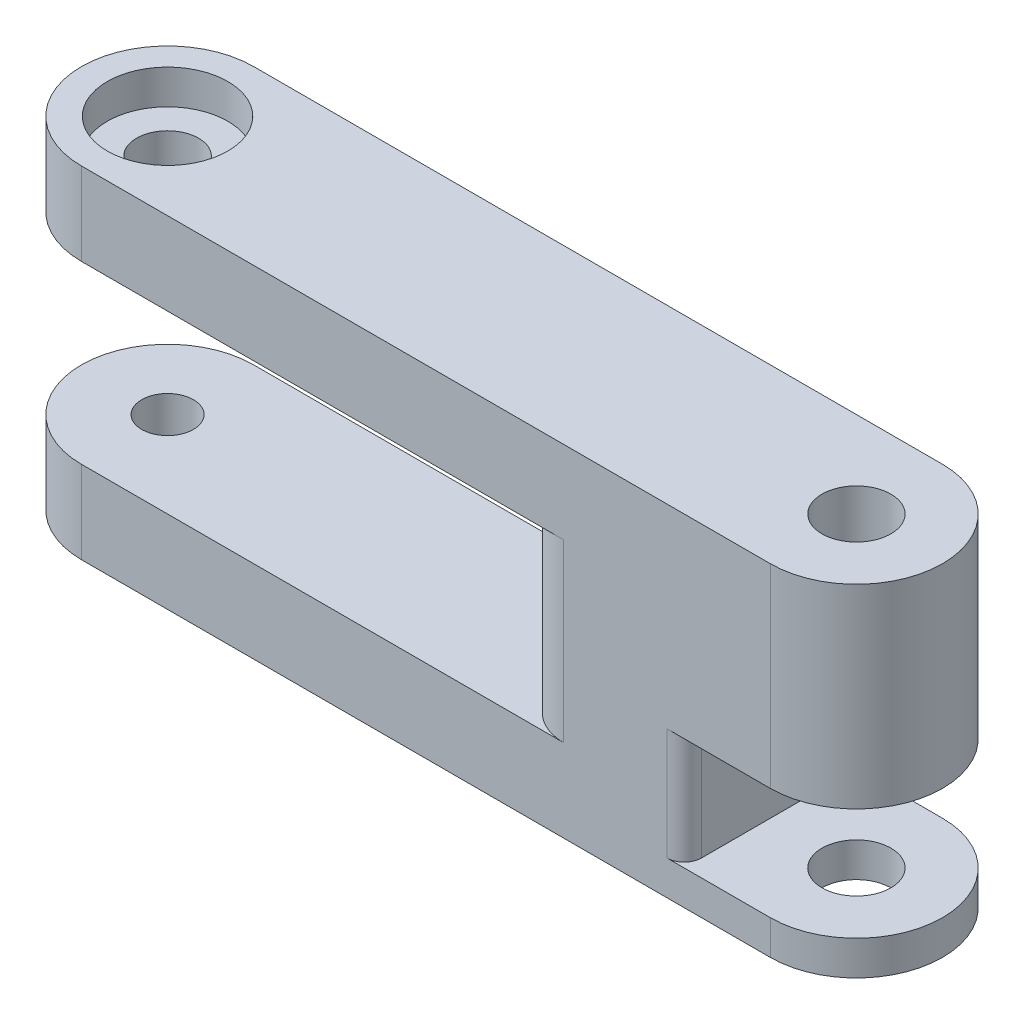
ISO-10303-21;
HEADER;
FILE_DESCRIPTION(('STEP AP214'),'2;1');
FILE_NAME('part.step','',(''),(''),'','','');
FILE_SCHEMA(('AUTOMOTIVE_DESIGN { 1 0 10303 214 1 1 1 1 }'));
ENDSEC;
DATA;
#1=APPLICATION_CONTEXT('core data for automotive mechanical design processes');
#2=APPLICATION_PROTOCOL_DEFINITION('international standard','automotive_design',2000,#1);
#3=PRODUCT_CONTEXT('',#1,'mechanical');
#4=PRODUCT('Part','Part','',(#3));
#5=PRODUCT_RELATED_PRODUCT_CATEGORY('part','',(#4));
#6=PRODUCT_DEFINITION_FORMATION('','',#4);
#7=PRODUCT_DEFINITION_CONTEXT('part definition',#1,'design');
#8=PRODUCT_DEFINITION('design','',#6,#7);
#9=PRODUCT_DEFINITION_SHAPE('','',#8);
#10=(LENGTH_UNIT() NAMED_UNIT(*) SI_UNIT(.MILLI.,.METRE.));
#11=(NAMED_UNIT(*) PLANE_ANGLE_UNIT() SI_UNIT($,.RADIAN.));
#12=(NAMED_UNIT(*) SI_UNIT($,.STERADIAN.) SOLID_ANGLE_UNIT());
#13=UNCERTAINTY_MEASURE_WITH_UNIT(LENGTH_MEASURE(1.E-05),#10,'distance_accuracy_value','');
#14=(GEOMETRIC_REPRESENTATION_CONTEXT(3) GLOBAL_UNCERTAINTY_ASSIGNED_CONTEXT((#13)) GLOBAL_UNIT_ASSIGNED_CONTEXT((#10,
#11,#12)) REPRESENTATION_CONTEXT('',''));
#15=CARTESIAN_POINT('',(0.,0.,0.));
#16=DIRECTION('',(0.,0.,1.));
#17=DIRECTION('',(1.,0.,0.));
#18=AXIS2_PLACEMENT_3D('',#15,#16,#17);
#19=CARTESIAN_POINT('',(25.4,12.573,0.));
#20=DIRECTION('',(0.,-1.,0.));
#21=DIRECTION('',(0.,0.,-1.));
#22=AXIS2_PLACEMENT_3D('',#19,#20,#21);
#23=CYLINDRICAL_SURFACE('',#22,6.35);
#24=CARTESIAN_POINT('',(25.4,-10.033,0.));
#25=DIRECTION('',(0.,-1.,0.));
#26=DIRECTION('',(1.,0.,0.));
#27=AXIS2_PLACEMENT_3D('',#24,#25,#26);
#28=CIRCLE('',#27,6.35);
#29=CARTESIAN_POINT('',(25.4,-10.033,-6.35000000000001));
#30=VERTEX_POINT('',#29);
#31=CARTESIAN_POINT('',(25.4,-10.033,6.34999999999999));
#32=VERTEX_POINT('',#31);
#33=EDGE_CURVE('E240',#30,#32,#28,.T.);
#34=ORIENTED_EDGE('',*,*,#33,.T.);
#35=DIRECTION('',(0.,-1.,0.));
#36=VECTOR('',#35,1.);
#37=CARTESIAN_POINT('',(25.4,12.573,6.34999999999999));
#38=LINE('',#37,#36);
#39=CARTESIAN_POINT('',(25.4,-12.573,6.34999999999999));
#40=VERTEX_POINT('',#39);
#41=EDGE_CURVE('E179',#32,#40,#38,.T.);
#42=ORIENTED_EDGE('',*,*,#41,.T.);
#43=CARTESIAN_POINT('',(25.4,-12.573,0.));
#44=DIRECTION('',(0.,1.,0.));
#45=DIRECTION('',(0.,0.,1.));
#46=AXIS2_PLACEMENT_3D('',#43,#44,#45);
#47=CIRCLE('',#46,6.35);
#48=CARTESIAN_POINT('',(25.4,-12.573,-6.35000000000001));
#49=VERTEX_POINT('',#48);
#50=EDGE_CURVE('E354',#40,#49,#47,.T.);
#51=ORIENTED_EDGE('',*,*,#50,.T.);
#52=DIRECTION('',(0.,-1.,0.));
#53=VECTOR('',#52,1.);
#54=CARTESIAN_POINT('',(25.4,12.573,-6.35000000000001));
#55=LINE('',#54,#53);
#56=EDGE_CURVE('E363',#30,#49,#55,.T.);
#57=ORIENTED_EDGE('',*,*,#56,.F.);
#58=EDGE_LOOP('',(#34,#42,#51,#57));
#59=FACE_BOUND('',#58,.T.);
#60=ADVANCED_FACE('F42',(#59),#23,.T.);
#61=CARTESIAN_POINT('',(25.4,12.573,0.));
#62=DIRECTION('',(0.,-1.,0.));
#63=DIRECTION('',(0.,0.,-1.));
#64=AXIS2_PLACEMENT_3D('',#61,#62,#63);
#65=CYLINDRICAL_SURFACE('',#64,2.54);
#66=CARTESIAN_POINT('',(25.4,-10.033,0.));
#67=DIRECTION('',(0.,-1.,0.));
#68=DIRECTION('',(1.,0.,0.));
#69=AXIS2_PLACEMENT_3D('',#66,#67,#68);
#70=CIRCLE('',#69,2.54);
#71=CARTESIAN_POINT('',(27.94,-10.033,0.));
#72=VERTEX_POINT('',#71);
#73=EDGE_CURVE('E163',#72,#72,#70,.T.);
#74=ORIENTED_EDGE('',*,*,#73,.F.);
#75=EDGE_LOOP('',(#74));
#76=FACE_BOUND('',#75,.T.);
#77=CARTESIAN_POINT('',(25.4,-12.573,0.));
#78=DIRECTION('',(0.,1.,0.));
#79=DIRECTION('',(0.,0.,1.));
#80=AXIS2_PLACEMENT_3D('',#77,#78,#79);
#81=CIRCLE('',#80,2.54);
#82=CARTESIAN_POINT('',(25.4,-12.573,2.53999999999999));
#83=VERTEX_POINT('',#82);
#84=EDGE_CURVE('E324',#83,#83,#81,.T.);
#85=ORIENTED_EDGE('',*,*,#84,.F.);
#86=EDGE_LOOP('',(#85));
#87=FACE_BOUND('',#86,.T.);
#88=ADVANCED_FACE('F420',(#76,#87),#65,.F.);
#89=CARTESIAN_POINT('',(-25.4,12.573,0.));
#90=DIRECTION('',(0.,-1.,0.));
#91=DIRECTION('',(0.,0.,-1.));
#92=AXIS2_PLACEMENT_3D('',#89,#90,#91);
#93=CYLINDRICAL_SURFACE('',#92,2.28600000000001);
#94=CARTESIAN_POINT('',(-25.4,6.477,0.));
#95=DIRECTION('',(0.,1.,0.));
#96=DIRECTION('',(0.,0.,1.));
#97=AXIS2_PLACEMENT_3D('',#94,#95,#96);
#98=CIRCLE('',#97,2.28600000000001);
#99=CARTESIAN_POINT('',(-25.4,6.477,2.28600000000001));
#100=VERTEX_POINT('',#99);
#101=EDGE_CURVE('E192',#100,#100,#98,.T.);
#102=ORIENTED_EDGE('',*,*,#101,.F.);
#103=EDGE_LOOP('',(#102));
#104=FACE_BOUND('',#103,.T.);
#105=CARTESIAN_POINT('',(-25.4,10.033,0.));
#106=DIRECTION('',(0.,1.,0.));
#107=DIRECTION('',(0.,0.,1.));
#108=AXIS2_PLACEMENT_3D('',#105,#106,#107);
#109=CIRCLE('',#108,2.28600000000001);
#110=CARTESIAN_POINT('',(-25.4,10.033,2.28600000000001));
#111=VERTEX_POINT('',#110);
#112=EDGE_CURVE('E198',#111,#111,#109,.T.);
#113=ORIENTED_EDGE('',*,*,#112,.T.);
#114=EDGE_LOOP('',(#113));
#115=FACE_BOUND('',#114,.T.);
#116=ADVANCED_FACE('F425',(#104,#115),#93,.F.);
#117=CARTESIAN_POINT('',(-25.4,12.573,0.));
#118=DIRECTION('',(0.,-1.,0.));
#119=DIRECTION('',(0.,0.,-1.));
#120=AXIS2_PLACEMENT_3D('',#117,#118,#119);
#121=CYLINDRICAL_SURFACE('',#120,6.35);
#122=DIRECTION('',(0.,-1.,0.));
#123=VECTOR('',#122,1.);
#124=CARTESIAN_POINT('',(-25.4,12.573,-6.35));
#125=LINE('',#124,#123);
#126=CARTESIAN_POINT('',(-25.4,12.573,-6.35));
#127=VERTEX_POINT('',#126);
#128=CARTESIAN_POINT('',(-25.4,6.477,-6.35000000000001));
#129=VERTEX_POINT('',#128);
#130=EDGE_CURVE('E360',#127,#129,#125,.T.);
#131=ORIENTED_EDGE('',*,*,#130,.T.);
#132=CARTESIAN_POINT('',(-25.4,6.477,0.));
#133=DIRECTION('',(0.,1.,0.));
#134=DIRECTION('',(0.,0.,1.));
#135=AXIS2_PLACEMENT_3D('',#132,#133,#134);
#136=CIRCLE('',#135,6.35);
#137=CARTESIAN_POINT('',(-25.4,6.477,6.34999999999999));
#138=VERTEX_POINT('',#137);
#139=EDGE_CURVE('E196',#129,#138,#136,.T.);
#140=ORIENTED_EDGE('',*,*,#139,.T.);
#141=DIRECTION('',(0.,-1.,0.));
#142=VECTOR('',#141,1.);
#143=CARTESIAN_POINT('',(-25.4,12.573,6.35));
#144=LINE('',#143,#142);
#145=CARTESIAN_POINT('',(-25.4,12.573,6.35));
#146=VERTEX_POINT('',#145);
#147=EDGE_CURVE('E183',#146,#138,#144,.T.);
#148=ORIENTED_EDGE('',*,*,#147,.F.);
#149=CARTESIAN_POINT('',(-25.4,12.573,0.));
#150=DIRECTION('',(0.,1.,0.));
#151=DIRECTION('',(0.,0.,1.));
#152=AXIS2_PLACEMENT_3D('',#149,#150,#151);
#153=CIRCLE('',#152,6.35);
#154=EDGE_CURVE('E333',#127,#146,#153,.T.);
#155=ORIENTED_EDGE('',*,*,#154,.F.);
#156=EDGE_LOOP('',(#131,#140,#148,#155));
#157=FACE_BOUND('',#156,.T.);
#158=ADVANCED_FACE('F406',(#157),#121,.T.);
#159=CARTESIAN_POINT('',(-25.4,12.573,0.));
#160=DIRECTION('',(0.,1.,0.));
#161=DIRECTION('',(0.,0.,1.));
#162=AXIS2_PLACEMENT_3D('',#159,#160,#161);
#163=PLANE('',#162);
#164=CARTESIAN_POINT('',(-25.4,12.573,0.));
#165=DIRECTION('',(0.,1.,0.));
#166=DIRECTION('',(0.,0.,1.));
#167=AXIS2_PLACEMENT_3D('',#164,#165,#166);
#168=CIRCLE('',#167,4.445);
#169=CARTESIAN_POINT('',(-25.4,12.573,4.445));
#170=VERTEX_POINT('',#169);
#171=EDGE_CURVE('E292',#170,#170,#168,.T.);
#172=ORIENTED_EDGE('',*,*,#171,.F.);
#173=EDGE_LOOP('',(#172));
#174=FACE_BOUND('',#173,.T.);
#175=ORIENTED_EDGE('',*,*,#154,.T.);
#176=DIRECTION('',(1.,0.,0.));
#177=VECTOR('',#176,1.);
#178=CARTESIAN_POINT('',(-25.4,12.573,6.35));
#179=LINE('',#178,#177);
#180=CARTESIAN_POINT('',(25.4,12.573,6.34999999999999));
#181=VERTEX_POINT('',#180);
#182=EDGE_CURVE('E337',#146,#181,#179,.T.);
#183=ORIENTED_EDGE('',*,*,#182,.T.);
#184=CARTESIAN_POINT('',(25.4,12.573,0.));
#185=DIRECTION('',(0.,1.,0.));
#186=DIRECTION('',(0.,0.,1.));
#187=AXIS2_PLACEMENT_3D('',#184,#185,#186);
#188=CIRCLE('',#187,6.35);
#189=CARTESIAN_POINT('',(25.4,12.573,-6.35000000000001));
#190=VERTEX_POINT('',#189);
#191=EDGE_CURVE('E176',#181,#190,#188,.T.);
#192=ORIENTED_EDGE('',*,*,#191,.T.);
#193=DIRECTION('',(-1.,0.,0.));
#194=VECTOR('',#193,1.);
#195=CARTESIAN_POINT('',(-25.4,12.573,-6.35));
#196=LINE('',#195,#194);
#197=EDGE_CURVE('E343',#190,#127,#196,.T.);
#198=ORIENTED_EDGE('',*,*,#197,.T.);
#199=EDGE_LOOP('',(#175,#183,#192,#198));
#200=FACE_BOUND('',#199,.T.);
#201=CARTESIAN_POINT('',(25.4,12.573,0.));
#202=DIRECTION('',(0.,1.,0.));
#203=DIRECTION('',(0.,0.,1.));
#204=AXIS2_PLACEMENT_3D('',#201,#202,#203);
#205=CIRCLE('',#204,2.54);
#206=CARTESIAN_POINT('',(25.4,12.573,2.53999999999999));
#207=VERTEX_POINT('',#206);
#208=EDGE_CURVE('E325',#207,#207,#205,.T.);
#209=ORIENTED_EDGE('',*,*,#208,.F.);
#210=EDGE_LOOP('',(#209));
#211=FACE_BOUND('',#210,.T.);
#212=ADVANCED_FACE('F408',(#174,#200,#211),#163,.T.);
#213=CARTESIAN_POINT('',(-25.4,-12.573,0.));
#214=DIRECTION('',(0.,1.,0.));
#215=DIRECTION('',(0.,0.,1.));
#216=AXIS2_PLACEMENT_3D('',#213,#214,#215);
#217=PLANE('',#216);
#218=CARTESIAN_POINT('',(-25.4,-12.573,0.));
#219=DIRECTION('',(0.,1.,0.));
#220=DIRECTION('',(0.,0.,1.));
#221=AXIS2_PLACEMENT_3D('',#218,#219,#220);
#222=CIRCLE('',#221,6.35);
#223=CARTESIAN_POINT('',(-25.4,-12.573,-6.35));
#224=VERTEX_POINT('',#223);
#225=CARTESIAN_POINT('',(-25.4,-12.573,6.35));
#226=VERTEX_POINT('',#225);
#227=EDGE_CURVE('E329',#224,#226,#222,.T.);
#228=ORIENTED_EDGE('',*,*,#227,.F.);
#229=DIRECTION('',(-1.,0.,0.));
#230=VECTOR('',#229,1.);
#231=CARTESIAN_POINT('',(-25.4,-12.573,-6.35));
#232=LINE('',#231,#230);
#233=EDGE_CURVE('E338',#49,#224,#232,.T.);
#234=ORIENTED_EDGE('',*,*,#233,.F.);
#235=ORIENTED_EDGE('',*,*,#50,.F.);
#236=DIRECTION('',(1.,0.,0.));
#237=VECTOR('',#236,1.);
#238=CARTESIAN_POINT('',(-25.4,-12.573,6.35));
#239=LINE('',#238,#237);
#240=EDGE_CURVE('E350',#226,#40,#239,.T.);
#241=ORIENTED_EDGE('',*,*,#240,.F.);
#242=EDGE_LOOP('',(#228,#234,#235,#241));
#243=FACE_BOUND('',#242,.T.);
#244=ORIENTED_EDGE('',*,*,#84,.T.);
#245=EDGE_LOOP('',(#244));
#246=FACE_BOUND('',#245,.T.);
#247=CARTESIAN_POINT('',(-25.4,-12.573,0.));
#248=DIRECTION('',(0.,1.,0.));
#249=DIRECTION('',(0.,0.,1.));
#250=AXIS2_PLACEMENT_3D('',#247,#248,#249);
#251=CIRCLE('',#250,1.905);
#252=CARTESIAN_POINT('',(-27.305,-12.573,0.));
#253=VERTEX_POINT('',#252);
#254=EDGE_CURVE('E288',#253,#253,#251,.F.);
#255=ORIENTED_EDGE('',*,*,#254,.F.);
#256=EDGE_LOOP('',(#255));
#257=FACE_BOUND('',#256,.T.);
#258=ADVANCED_FACE('F382',(#243,#246,#257),#217,.F.);
#259=CARTESIAN_POINT('',(-25.4,-6.477,6.34999999999999));
#260=VERTEX_POINT('',#259);
#261=EDGE_CURVE('E178',#260,#226,#144,.T.);
#262=ORIENTED_EDGE('',*,*,#261,.F.);
#263=CARTESIAN_POINT('',(-25.4,-6.477,0.));
#264=DIRECTION('',(0.,-1.,0.));
#265=DIRECTION('',(0.,0.,-1.));
#266=AXIS2_PLACEMENT_3D('',#263,#264,#265);
#267=CIRCLE('',#266,6.35);
#268=CARTESIAN_POINT('',(-25.4,-6.477,-6.35000000000001));
#269=VERTEX_POINT('',#268);
#270=EDGE_CURVE('E197',#260,#269,#267,.T.);
#271=ORIENTED_EDGE('',*,*,#270,.T.);
#272=EDGE_CURVE('E346',#269,#224,#125,.T.);
#273=ORIENTED_EDGE('',*,*,#272,.T.);
#274=ORIENTED_EDGE('',*,*,#227,.T.);
#275=EDGE_LOOP('',(#262,#271,#273,#274));
#276=FACE_BOUND('',#275,.T.);
#277=ADVANCED_FACE('F372',(#276),#121,.T.);
#278=CARTESIAN_POINT('',(-25.4,12.573,6.35));
#279=DIRECTION('',(0.,0.,-1.));
#280=DIRECTION('',(-1.,0.,0.));
#281=AXIS2_PLACEMENT_3D('',#278,#279,#280);
#282=PLANE('',#281);
#283=DIRECTION('',(1.,0.,0.));
#284=VECTOR('',#283,1.);
#285=CARTESIAN_POINT('',(31.75,-10.033,6.34999999999999));
#286=LINE('',#285,#284);
#287=CARTESIAN_POINT('',(17.78,-10.033,6.34999999999999));
#288=VERTEX_POINT('',#287);
#289=EDGE_CURVE('E58',#288,#32,#286,.T.);
#290=ORIENTED_EDGE('',*,*,#289,.F.);
#291=DIRECTION('',(0.,-1.,0.));
#292=VECTOR('',#291,1.);
#293=CARTESIAN_POINT('',(17.78,12.573,6.34999999999999));
#294=LINE('',#293,#292);
#295=CARTESIAN_POINT('',(17.78,-1.778,6.34999999999999));
#296=VERTEX_POINT('',#295);
#297=EDGE_CURVE('E171',#288,#296,#294,.F.);
#298=ORIENTED_EDGE('',*,*,#297,.T.);
#299=DIRECTION('',(-1.,0.,0.));
#300=VECTOR('',#299,1.);
#301=CARTESIAN_POINT('',(31.75,-1.778,6.34999999999999));
#302=LINE('',#301,#300);
#303=CARTESIAN_POINT('',(25.4,-1.778,6.34999999999999));
#304=VERTEX_POINT('',#303);
#305=EDGE_CURVE('E65',#304,#296,#302,.T.);
#306=ORIENTED_EDGE('',*,*,#305,.F.);
#307=EDGE_CURVE('E168',#181,#304,#38,.T.);
#308=ORIENTED_EDGE('',*,*,#307,.F.);
#309=ORIENTED_EDGE('',*,*,#182,.F.);
#310=ORIENTED_EDGE('',*,*,#147,.T.);
#311=DIRECTION('',(-1.,0.,0.));
#312=VECTOR('',#311,1.);
#313=CARTESIAN_POINT('',(-31.75,6.477,6.34999999999999));
#314=LINE('',#313,#312);
#315=CARTESIAN_POINT('',(10.16,6.477,6.34999999999999));
#316=VERTEX_POINT('',#315);
#317=EDGE_CURVE('E303',#316,#138,#314,.T.);
#318=ORIENTED_EDGE('',*,*,#317,.F.);
#319=DIRECTION('',(0.,1.,0.));
#320=VECTOR('',#319,1.);
#321=CARTESIAN_POINT('',(10.16,12.573,6.34999999999999));
#322=LINE('',#321,#320);
#323=CARTESIAN_POINT('',(10.16,-6.477,6.34999999999999));
#324=VERTEX_POINT('',#323);
#325=EDGE_CURVE('E214',#316,#324,#322,.F.);
#326=ORIENTED_EDGE('',*,*,#325,.T.);
#327=DIRECTION('',(1.,0.,0.));
#328=VECTOR('',#327,1.);
#329=CARTESIAN_POINT('',(-31.75,-6.477,6.34999999999999));
#330=LINE('',#329,#328);
#331=EDGE_CURVE('E202',#260,#324,#330,.T.);
#332=ORIENTED_EDGE('',*,*,#331,.F.);
#333=ORIENTED_EDGE('',*,*,#261,.T.);
#334=ORIENTED_EDGE('',*,*,#240,.T.);
#335=ORIENTED_EDGE('',*,*,#41,.F.);
#336=EDGE_LOOP('',(#290,#298,#306,#308,#309,#310,#318,#326,#332,#333,#334,#335));
#337=FACE_BOUND('',#336,.T.);
#338=ADVANCED_FACE('F167',(#337),#282,.F.);
#339=ORIENTED_EDGE('',*,*,#307,.T.);
#340=CARTESIAN_POINT('',(25.4,-1.778,0.));
#341=DIRECTION('',(0.,1.,0.));
#342=DIRECTION('',(-1.,0.,0.));
#343=AXIS2_PLACEMENT_3D('',#340,#341,#342);
#344=CIRCLE('',#343,6.35);
#345=CARTESIAN_POINT('',(25.4,-1.778,-6.35000000000001));
#346=VERTEX_POINT('',#345);
#347=EDGE_CURVE('E154',#304,#346,#344,.T.);
#348=ORIENTED_EDGE('',*,*,#347,.T.);
#349=EDGE_CURVE('E185',#190,#346,#55,.T.);
#350=ORIENTED_EDGE('',*,*,#349,.F.);
#351=ORIENTED_EDGE('',*,*,#191,.F.);
#352=EDGE_LOOP('',(#339,#348,#350,#351));
#353=FACE_BOUND('',#352,.T.);
#354=ADVANCED_FACE('F175',(#353),#23,.T.);
#355=CARTESIAN_POINT('',(-25.4,12.573,-6.35));
#356=DIRECTION('',(0.,0.,1.));
#357=DIRECTION('',(1.,0.,0.));
#358=AXIS2_PLACEMENT_3D('',#355,#356,#357);
#359=PLANE('',#358);
#360=DIRECTION('',(0.,-1.,0.));
#361=VECTOR('',#360,1.);
#362=CARTESIAN_POINT('',(17.78,12.573,-6.35000000000001));
#363=LINE('',#362,#361);
#364=CARTESIAN_POINT('',(17.78,-1.778,-6.35000000000001));
#365=VERTEX_POINT('',#364);
#366=CARTESIAN_POINT('',(17.78,-10.033,-6.35000000000001));
#367=VERTEX_POINT('',#366);
#368=EDGE_CURVE('E232',#365,#367,#363,.T.);
#369=ORIENTED_EDGE('',*,*,#368,.T.);
#370=DIRECTION('',(1.,0.,0.));
#371=VECTOR('',#370,1.);
#372=CARTESIAN_POINT('',(31.75,-10.033,-6.35000000000001));
#373=LINE('',#372,#371);
#374=EDGE_CURVE('E273',#367,#30,#373,.T.);
#375=ORIENTED_EDGE('',*,*,#374,.T.);
#376=ORIENTED_EDGE('',*,*,#56,.T.);
#377=ORIENTED_EDGE('',*,*,#233,.T.);
#378=ORIENTED_EDGE('',*,*,#272,.F.);
#379=DIRECTION('',(1.,0.,0.));
#380=VECTOR('',#379,1.);
#381=CARTESIAN_POINT('',(-31.75,-6.477,-6.35000000000001));
#382=LINE('',#381,#380);
#383=CARTESIAN_POINT('',(10.16,-6.477,-6.35000000000001));
#384=VERTEX_POINT('',#383);
#385=EDGE_CURVE('E299',#269,#384,#382,.T.);
#386=ORIENTED_EDGE('',*,*,#385,.T.);
#387=DIRECTION('',(0.,1.,0.));
#388=VECTOR('',#387,1.);
#389=CARTESIAN_POINT('',(10.16,12.573,-6.35000000000001));
#390=LINE('',#389,#388);
#391=CARTESIAN_POINT('',(10.16,6.477,-6.35000000000001));
#392=VERTEX_POINT('',#391);
#393=EDGE_CURVE('E191',#384,#392,#390,.T.);
#394=ORIENTED_EDGE('',*,*,#393,.T.);
#395=DIRECTION('',(-1.,0.,0.));
#396=VECTOR('',#395,1.);
#397=CARTESIAN_POINT('',(-31.75,6.477,-6.35000000000001));
#398=LINE('',#397,#396);
#399=EDGE_CURVE('E302',#392,#129,#398,.T.);
#400=ORIENTED_EDGE('',*,*,#399,.T.);
#401=ORIENTED_EDGE('',*,*,#130,.F.);
#402=ORIENTED_EDGE('',*,*,#197,.F.);
#403=ORIENTED_EDGE('',*,*,#349,.T.);
#404=DIRECTION('',(-1.,0.,0.));
#405=VECTOR('',#404,1.);
#406=CARTESIAN_POINT('',(31.75,-1.778,-6.35000000000001));
#407=LINE('',#406,#405);
#408=EDGE_CURVE('E157',#346,#365,#407,.T.);
#409=ORIENTED_EDGE('',*,*,#408,.T.);
#410=EDGE_LOOP('',(#369,#375,#376,#377,#378,#386,#394,#400,#401,#402,#403,#409));
#411=FACE_BOUND('',#410,.T.);
#412=ADVANCED_FACE('F377',(#411),#359,.F.);
#413=CARTESIAN_POINT('',(25.4,-1.778,0.));
#414=DIRECTION('',(0.,1.,0.));
#415=DIRECTION('',(-1.,0.,0.));
#416=AXIS2_PLACEMENT_3D('',#413,#414,#415);
#417=CIRCLE('',#416,2.54);
#418=CARTESIAN_POINT('',(22.86,-1.778,0.));
#419=VERTEX_POINT('',#418);
#420=EDGE_CURVE('E164',#419,#419,#417,.T.);
#421=ORIENTED_EDGE('',*,*,#420,.F.);
#422=EDGE_LOOP('',(#421));
#423=FACE_BOUND('',#422,.T.);
#424=ORIENTED_EDGE('',*,*,#208,.T.);
#425=EDGE_LOOP('',(#424));
#426=FACE_BOUND('',#425,.T.);
#427=ADVANCED_FACE('F428',(#423,#426),#65,.F.);
#428=CARTESIAN_POINT('',(-31.75,6.477,-6.35000000000001));
#429=DIRECTION('',(0.,1.,0.));
#430=DIRECTION('',(0.,0.,1.));
#431=AXIS2_PLACEMENT_3D('',#428,#429,#430);
#432=PLANE('',#431);
#433=ORIENTED_EDGE('',*,*,#101,.T.);
#434=EDGE_LOOP('',(#433));
#435=FACE_BOUND('',#434,.T.);
#436=ORIENTED_EDGE('',*,*,#399,.F.);
#437=CARTESIAN_POINT('',(10.16,6.477,-2.54000000000001));
#438=DIRECTION('',(0.,1.,0.));
#439=DIRECTION('',(0.,0.,1.));
#440=AXIS2_PLACEMENT_3D('',#437,#438,#439);
#441=CIRCLE('',#440,3.81);
#442=CARTESIAN_POINT('',(6.35,6.477,-2.54000000000001));
#443=VERTEX_POINT('',#442);
#444=EDGE_CURVE('E218',#392,#443,#441,.T.);
#445=ORIENTED_EDGE('',*,*,#444,.T.);
#446=DIRECTION('',(0.,0.,1.));
#447=VECTOR('',#446,1.);
#448=CARTESIAN_POINT('',(6.35,6.477,-6.35000000000001));
#449=LINE('',#448,#447);
#450=CARTESIAN_POINT('',(6.35,6.477,2.53999999999999));
#451=VERTEX_POINT('',#450);
#452=EDGE_CURVE('E313',#443,#451,#449,.T.);
#453=ORIENTED_EDGE('',*,*,#452,.T.);
#454=CARTESIAN_POINT('',(10.16,6.477,2.53999999999999));
#455=DIRECTION('',(0.,1.,0.));
#456=DIRECTION('',(0.,0.,1.));
#457=AXIS2_PLACEMENT_3D('',#454,#455,#456);
#458=CIRCLE('',#457,3.81);
#459=EDGE_CURVE('E225',#451,#316,#458,.T.);
#460=ORIENTED_EDGE('',*,*,#459,.T.);
#461=ORIENTED_EDGE('',*,*,#317,.T.);
#462=ORIENTED_EDGE('',*,*,#139,.F.);
#463=EDGE_LOOP('',(#436,#445,#453,#460,#461,#462));
#464=FACE_BOUND('',#463,.T.);
#465=ADVANCED_FACE('F399',(#435,#464),#432,.F.);
#466=CARTESIAN_POINT('',(-31.75,-6.477,-6.35000000000001));
#467=DIRECTION('',(0.,-1.,0.));
#468=DIRECTION('',(0.,0.,-1.));
#469=AXIS2_PLACEMENT_3D('',#466,#467,#468);
#470=PLANE('',#469);
#471=ORIENTED_EDGE('',*,*,#331,.T.);
#472=CARTESIAN_POINT('',(10.16,-6.477,2.53999999999999));
#473=DIRECTION('',(0.,-1.,0.));
#474=DIRECTION('',(0.,0.,-1.));
#475=AXIS2_PLACEMENT_3D('',#472,#473,#474);
#476=CIRCLE('',#475,3.81);
#477=CARTESIAN_POINT('',(6.35,-6.477,2.53999999999999));
#478=VERTEX_POINT('',#477);
#479=EDGE_CURVE('E229',#324,#478,#476,.T.);
#480=ORIENTED_EDGE('',*,*,#479,.T.);
#481=DIRECTION('',(0.,0.,1.));
#482=VECTOR('',#481,1.);
#483=CARTESIAN_POINT('',(6.35,-6.477,-6.35000000000001));
#484=LINE('',#483,#482);
#485=CARTESIAN_POINT('',(6.35,-6.477,-2.54000000000001));
#486=VERTEX_POINT('',#485);
#487=EDGE_CURVE('E307',#486,#478,#484,.T.);
#488=ORIENTED_EDGE('',*,*,#487,.F.);
#489=CARTESIAN_POINT('',(10.16,-6.477,-2.54000000000001));
#490=DIRECTION('',(0.,-1.,0.));
#491=DIRECTION('',(0.,0.,-1.));
#492=AXIS2_PLACEMENT_3D('',#489,#490,#491);
#493=CIRCLE('',#492,3.81);
#494=EDGE_CURVE('E221',#486,#384,#493,.T.);
#495=ORIENTED_EDGE('',*,*,#494,.T.);
#496=ORIENTED_EDGE('',*,*,#385,.F.);
#497=ORIENTED_EDGE('',*,*,#270,.F.);
#498=EDGE_LOOP('',(#471,#480,#488,#495,#496,#497));
#499=FACE_BOUND('',#498,.T.);
#500=CARTESIAN_POINT('',(-25.4,-6.477,0.));
#501=DIRECTION('',(0.,1.,0.));
#502=DIRECTION('',(-1.,0.,0.));
#503=AXIS2_PLACEMENT_3D('',#500,#501,#502);
#504=CIRCLE('',#503,1.905);
#505=CARTESIAN_POINT('',(-27.305,-6.477,0.));
#506=VERTEX_POINT('',#505);
#507=EDGE_CURVE('E284',#506,#506,#504,.T.);
#508=ORIENTED_EDGE('',*,*,#507,.F.);
#509=EDGE_LOOP('',(#508));
#510=FACE_BOUND('',#509,.T.);
#511=ADVANCED_FACE('F388',(#499,#510),#470,.F.);
#512=CARTESIAN_POINT('',(6.35,6.477,-6.35000000000001));
#513=DIRECTION('',(1.,0.,0.));
#514=DIRECTION('',(0.,0.,-1.));
#515=AXIS2_PLACEMENT_3D('',#512,#513,#514);
#516=PLANE('',#515);
#517=ORIENTED_EDGE('',*,*,#452,.F.);
#518=DIRECTION('',(0.,1.,0.));
#519=VECTOR('',#518,1.);
#520=CARTESIAN_POINT('',(6.35,6.477,-2.54000000000001));
#521=LINE('',#520,#519);
#522=EDGE_CURVE('E211',#443,#486,#521,.F.);
#523=ORIENTED_EDGE('',*,*,#522,.T.);
#524=ORIENTED_EDGE('',*,*,#487,.T.);
#525=DIRECTION('',(0.,1.,0.));
#526=VECTOR('',#525,1.);
#527=CARTESIAN_POINT('',(6.35,6.477,2.53999999999999));
#528=LINE('',#527,#526);
#529=EDGE_CURVE('E207',#478,#451,#528,.T.);
#530=ORIENTED_EDGE('',*,*,#529,.T.);
#531=EDGE_LOOP('',(#517,#523,#524,#530));
#532=FACE_BOUND('',#531,.T.);
#533=ADVANCED_FACE('F401',(#532),#516,.F.);
#534=CARTESIAN_POINT('',(-25.4,10.033,0.));
#535=DIRECTION('',(0.,1.,0.));
#536=DIRECTION('',(0.,0.,1.));
#537=AXIS2_PLACEMENT_3D('',#534,#535,#536);
#538=CYLINDRICAL_SURFACE('',#537,4.445);
#539=CARTESIAN_POINT('',(-25.4,10.033,0.));
#540=DIRECTION('',(0.,1.,0.));
#541=DIRECTION('',(0.,0.,1.));
#542=AXIS2_PLACEMENT_3D('',#539,#540,#541);
#543=CIRCLE('',#542,4.445);
#544=CARTESIAN_POINT('',(-25.4,10.033,4.445));
#545=VERTEX_POINT('',#544);
#546=EDGE_CURVE('E203',#545,#545,#543,.T.);
#547=ORIENTED_EDGE('',*,*,#546,.F.);
#548=EDGE_LOOP('',(#547));
#549=FACE_BOUND('',#548,.T.);
#550=ORIENTED_EDGE('',*,*,#171,.T.);
#551=EDGE_LOOP('',(#550));
#552=FACE_BOUND('',#551,.T.);
#553=ADVANCED_FACE('F464',(#549,#552),#538,.F.);
#554=CARTESIAN_POINT('',(-25.4,10.033,0.));
#555=DIRECTION('',(0.,1.,0.));
#556=DIRECTION('',(0.,0.,1.));
#557=AXIS2_PLACEMENT_3D('',#554,#555,#556);
#558=PLANE('',#557);
#559=ORIENTED_EDGE('',*,*,#112,.F.);
#560=EDGE_LOOP('',(#559));
#561=FACE_BOUND('',#560,.T.);
#562=ORIENTED_EDGE('',*,*,#546,.T.);
#563=EDGE_LOOP('',(#562));
#564=FACE_BOUND('',#563,.T.);
#565=ADVANCED_FACE('F460',(#561,#564),#558,.T.);
#566=CARTESIAN_POINT('',(-25.4,-19.0387844071698,0.));
#567=DIRECTION('',(0.,1.,0.));
#568=DIRECTION('',(-1.,0.,0.));
#569=AXIS2_PLACEMENT_3D('',#566,#567,#568);
#570=CYLINDRICAL_SURFACE('',#569,1.905);
#571=CARTESIAN_POINT('',(-27.305,-12.573,0.));
#572=CARTESIAN_POINT('',(-27.305,-12.5095,0.));
#573=CARTESIAN_POINT('',(-27.305,-12.446,0.));
#574=CARTESIAN_POINT('',(-27.305,-12.319,0.));
#575=CARTESIAN_POINT('',(-27.305,-12.2555,0.));
#576=CARTESIAN_POINT('',(-27.305,-12.1285,0.));
#577=CARTESIAN_POINT('',(-27.305,-12.065,0.));
#578=CARTESIAN_POINT('',(-27.305,-11.938,0.));
#579=CARTESIAN_POINT('',(-27.305,-11.8745,0.));
#580=CARTESIAN_POINT('',(-27.305,-11.7475,0.));
#581=CARTESIAN_POINT('',(-27.305,-11.684,0.));
#582=CARTESIAN_POINT('',(-27.305,-11.557,0.));
#583=CARTESIAN_POINT('',(-27.305,-11.4935,0.));
#584=CARTESIAN_POINT('',(-27.305,-11.3665,0.));
#585=CARTESIAN_POINT('',(-27.305,-11.303,0.));
#586=CARTESIAN_POINT('',(-27.305,-11.176,0.));
#587=CARTESIAN_POINT('',(-27.305,-11.1125,0.));
#588=CARTESIAN_POINT('',(-27.305,-10.9855,0.));
#589=CARTESIAN_POINT('',(-27.305,-10.922,0.));
#590=CARTESIAN_POINT('',(-27.305,-10.795,0.));
#591=CARTESIAN_POINT('',(-27.305,-10.7315,0.));
#592=CARTESIAN_POINT('',(-27.305,-10.6045,0.));
#593=CARTESIAN_POINT('',(-27.305,-10.541,0.));
#594=CARTESIAN_POINT('',(-27.305,-10.414,0.));
#595=CARTESIAN_POINT('',(-27.305,-10.3505,0.));
#596=CARTESIAN_POINT('',(-27.305,-10.2235,0.));
#597=CARTESIAN_POINT('',(-27.305,-10.16,0.));
#598=CARTESIAN_POINT('',(-27.305,-10.033,0.));
#599=CARTESIAN_POINT('',(-27.305,-9.9695,0.));
#600=CARTESIAN_POINT('',(-27.305,-9.8425,0.));
#601=CARTESIAN_POINT('',(-27.305,-9.779,0.));
#602=CARTESIAN_POINT('',(-27.305,-9.652,0.));
#603=CARTESIAN_POINT('',(-27.305,-9.5885,0.));
#604=CARTESIAN_POINT('',(-27.305,-9.4615,0.));
#605=CARTESIAN_POINT('',(-27.305,-9.398,0.));
#606=CARTESIAN_POINT('',(-27.305,-9.271,0.));
#607=CARTESIAN_POINT('',(-27.305,-9.2075,0.));
#608=CARTESIAN_POINT('',(-27.305,-9.0805,0.));
#609=CARTESIAN_POINT('',(-27.305,-9.017,0.));
#610=CARTESIAN_POINT('',(-27.305,-8.89,0.));
#611=CARTESIAN_POINT('',(-27.305,-8.8265,0.));
#612=CARTESIAN_POINT('',(-27.305,-8.6995,0.));
#613=CARTESIAN_POINT('',(-27.305,-8.636,0.));
#614=CARTESIAN_POINT('',(-27.305,-8.509,0.));
#615=CARTESIAN_POINT('',(-27.305,-8.4455,0.));
#616=CARTESIAN_POINT('',(-27.305,-8.3185,0.));
#617=CARTESIAN_POINT('',(-27.305,-8.255,0.));
#618=CARTESIAN_POINT('',(-27.305,-8.128,0.));
#619=CARTESIAN_POINT('',(-27.305,-8.0645,0.));
#620=CARTESIAN_POINT('',(-27.305,-7.9375,0.));
#621=CARTESIAN_POINT('',(-27.305,-7.874,0.));
#622=CARTESIAN_POINT('',(-27.305,-7.747,0.));
#623=CARTESIAN_POINT('',(-27.305,-7.6835,0.));
#624=CARTESIAN_POINT('',(-27.305,-7.5565,0.));
#625=CARTESIAN_POINT('',(-27.305,-7.493,0.));
#626=CARTESIAN_POINT('',(-27.305,-7.366,0.));
#627=CARTESIAN_POINT('',(-27.305,-7.3025,0.));
#628=CARTESIAN_POINT('',(-27.305,-7.1755,0.));
#629=CARTESIAN_POINT('',(-27.305,-7.112,0.));
#630=CARTESIAN_POINT('',(-27.305,-6.985,0.));
#631=CARTESIAN_POINT('',(-27.305,-6.9215,0.));
#632=CARTESIAN_POINT('',(-27.305,-6.7945,0.));
#633=CARTESIAN_POINT('',(-27.305,-6.731,0.));
#634=CARTESIAN_POINT('',(-27.305,-6.604,0.));
#635=CARTESIAN_POINT('',(-27.305,-6.5405,0.));
#636=CARTESIAN_POINT('',(-27.305,-6.477,0.));
#637=B_SPLINE_CURVE_WITH_KNOTS('',3,(#571,#572,#573,#574,#575,#576,#577,#578,#579,#580,#581,
#582,#583,#584,#585,#586,#587,#588,#589,#590,#591,#592,#593,#594,#595,#596,#597,#598,#599,#600,
#601,#602,#603,#604,#605,#606,#607,#608,#609,#610,#611,#612,#613,#614,#615,#616,#617,#618,#619,
#620,#621,#622,#623,#624,#625,#626,#627,#628,#629,#630,#631,#632,#633,#634,#635,#636),
.UNSPECIFIED.,.F.,.F.,(4,2,2,2,2,2,2,2,2,2,2,2,2,2,2,2,2,2,2,2,2,2,2,2,2,2,2,2,2,2,2,2,4),(0.,
0.1905,0.381000000000001,0.571500000000001,0.762000000000002,0.952500000000002,1.143,1.3335,
1.524,1.7145,1.905,2.0955,2.286,2.4765,2.667,2.8575,3.048,3.2385,3.429,3.6195,3.81,4.0005,4.191,
4.3815,4.572,4.7625,4.953,5.1435,5.334,5.5245,5.715,5.9055,6.096),.UNSPECIFIED.);
#638=EDGE_CURVE('BSEAM443',#253,#506,#637,.T.);
#639=ORIENTED_EDGE('',*,*,#254,.T.);
#640=ORIENTED_EDGE('',*,*,#507,.T.);
#641=ORIENTED_EDGE('',*,*,#638,.T.);
#642=ORIENTED_EDGE('',*,*,#638,.F.);
#643=EDGE_LOOP('',(#639,#641,#640,#642));
#644=FACE_BOUND('',#643,.T.);
#645=ADVANCED_FACE('F443',(#644),#570,.F.);
#646=CARTESIAN_POINT('',(10.16,12.573,-2.54000000000001));
#647=DIRECTION('',(0.,1.,0.));
#648=DIRECTION('',(0.,0.,1.));
#649=AXIS2_PLACEMENT_3D('',#646,#647,#648);
#650=CYLINDRICAL_SURFACE('',#649,3.81);
#651=ORIENTED_EDGE('',*,*,#494,.F.);
#652=ORIENTED_EDGE('',*,*,#522,.F.);
#653=ORIENTED_EDGE('',*,*,#444,.F.);
#654=ORIENTED_EDGE('',*,*,#393,.F.);
#655=EDGE_LOOP('',(#651,#652,#653,#654));
#656=FACE_BOUND('',#655,.T.);
#657=ADVANCED_FACE('F395',(#656),#650,.T.);
#658=CARTESIAN_POINT('',(10.16,6.477,2.53999999999999));
#659=DIRECTION('',(0.,1.,0.));
#660=DIRECTION('',(0.,0.,1.));
#661=AXIS2_PLACEMENT_3D('',#658,#659,#660);
#662=CYLINDRICAL_SURFACE('',#661,3.81);
#663=ORIENTED_EDGE('',*,*,#479,.F.);
#664=ORIENTED_EDGE('',*,*,#325,.F.);
#665=ORIENTED_EDGE('',*,*,#459,.F.);
#666=ORIENTED_EDGE('',*,*,#529,.F.);
#667=EDGE_LOOP('',(#663,#664,#665,#666));
#668=FACE_BOUND('',#667,.T.);
#669=ADVANCED_FACE('F404',(#668),#662,.T.);
#670=CARTESIAN_POINT('',(31.75,-10.033,-6.35000000000001));
#671=DIRECTION('',(0.,-1.,0.));
#672=DIRECTION('',(1.,0.,0.));
#673=AXIS2_PLACEMENT_3D('',#670,#671,#672);
#674=PLANE('',#673);
#675=ORIENTED_EDGE('',*,*,#73,.T.);
#676=EDGE_LOOP('',(#675));
#677=FACE_BOUND('',#676,.T.);
#678=ORIENTED_EDGE('',*,*,#33,.F.);
#679=ORIENTED_EDGE('',*,*,#374,.F.);
#680=CARTESIAN_POINT('',(17.78,-10.033,-5.08000000000001));
#681=DIRECTION('',(0.,-1.,0.));
#682=DIRECTION('',(1.,0.,0.));
#683=AXIS2_PLACEMENT_3D('',#680,#681,#682);
#684=CIRCLE('',#683,1.27);
#685=CARTESIAN_POINT('',(19.05,-10.033,-5.08000000000001));
#686=VERTEX_POINT('',#685);
#687=EDGE_CURVE('E253',#367,#686,#684,.T.);
#688=ORIENTED_EDGE('',*,*,#687,.T.);
#689=DIRECTION('',(0.,0.,1.));
#690=VECTOR('',#689,1.);
#691=CARTESIAN_POINT('',(19.05,-10.033,-6.35000000000001));
#692=LINE('',#691,#690);
#693=CARTESIAN_POINT('',(19.05,-10.033,5.07999999999999));
#694=VERTEX_POINT('',#693);
#695=EDGE_CURVE('E236',#686,#694,#692,.T.);
#696=ORIENTED_EDGE('',*,*,#695,.T.);
#697=CARTESIAN_POINT('',(17.78,-10.033,5.07999999999999));
#698=DIRECTION('',(0.,-1.,0.));
#699=DIRECTION('',(1.,0.,0.));
#700=AXIS2_PLACEMENT_3D('',#697,#698,#699);
#701=CIRCLE('',#700,1.27);
#702=EDGE_CURVE('E51',#694,#288,#701,.T.);
#703=ORIENTED_EDGE('',*,*,#702,.T.);
#704=ORIENTED_EDGE('',*,*,#289,.T.);
#705=EDGE_LOOP('',(#678,#679,#688,#696,#703,#704));
#706=FACE_BOUND('',#705,.T.);
#707=ADVANCED_FACE('F261',(#677,#706),#674,.F.);
#708=CARTESIAN_POINT('',(31.75,-1.778,-6.35000000000001));
#709=DIRECTION('',(0.,1.,0.));
#710=DIRECTION('',(-1.,0.,0.));
#711=AXIS2_PLACEMENT_3D('',#708,#709,#710);
#712=PLANE('',#711);
#713=ORIENTED_EDGE('',*,*,#420,.T.);
#714=EDGE_LOOP('',(#713));
#715=FACE_BOUND('',#714,.T.);
#716=ORIENTED_EDGE('',*,*,#305,.T.);
#717=CARTESIAN_POINT('',(17.78,-1.778,5.07999999999999));
#718=DIRECTION('',(0.,1.,0.));
#719=DIRECTION('',(-1.,0.,0.));
#720=AXIS2_PLACEMENT_3D('',#717,#718,#719);
#721=CIRCLE('',#720,1.27);
#722=CARTESIAN_POINT('',(19.05,-1.778,5.07999999999999));
#723=VERTEX_POINT('',#722);
#724=EDGE_CURVE('E11',#296,#723,#721,.T.);
#725=ORIENTED_EDGE('',*,*,#724,.T.);
#726=DIRECTION('',(0.,0.,1.));
#727=VECTOR('',#726,1.);
#728=CARTESIAN_POINT('',(19.05,-1.778,-6.35000000000001));
#729=LINE('',#728,#727);
#730=CARTESIAN_POINT('',(19.05,-1.778,-5.08000000000001));
#731=VERTEX_POINT('',#730);
#732=EDGE_CURVE('E267',#731,#723,#729,.T.);
#733=ORIENTED_EDGE('',*,*,#732,.F.);
#734=CARTESIAN_POINT('',(17.78,-1.778,-5.08000000000001));
#735=DIRECTION('',(0.,1.,0.));
#736=DIRECTION('',(-1.,0.,0.));
#737=AXIS2_PLACEMENT_3D('',#734,#735,#736);
#738=CIRCLE('',#737,1.27);
#739=EDGE_CURVE('E256',#731,#365,#738,.T.);
#740=ORIENTED_EDGE('',*,*,#739,.T.);
#741=ORIENTED_EDGE('',*,*,#408,.F.);
#742=ORIENTED_EDGE('',*,*,#347,.F.);
#743=EDGE_LOOP('',(#716,#725,#733,#740,#741,#742));
#744=FACE_BOUND('',#743,.T.);
#745=ADVANCED_FACE('F155',(#715,#744),#712,.F.);
#746=CARTESIAN_POINT('',(19.05,-1.778,-6.35000000000001));
#747=DIRECTION('',(-1.,0.,0.));
#748=DIRECTION('',(0.,0.,1.));
#749=AXIS2_PLACEMENT_3D('',#746,#747,#748);
#750=PLANE('',#749);
#751=ORIENTED_EDGE('',*,*,#695,.F.);
#752=DIRECTION('',(0.,-1.,0.));
#753=VECTOR('',#752,1.);
#754=CARTESIAN_POINT('',(19.05,-1.778,-5.08000000000001));
#755=LINE('',#754,#753);
#756=EDGE_CURVE('E248',#686,#731,#755,.F.);
#757=ORIENTED_EDGE('',*,*,#756,.T.);
#758=ORIENTED_EDGE('',*,*,#732,.T.);
#759=DIRECTION('',(0.,-1.,0.));
#760=VECTOR('',#759,1.);
#761=CARTESIAN_POINT('',(19.05,-1.778,5.07999999999999));
#762=LINE('',#761,#760);
#763=EDGE_CURVE('E244',#723,#694,#762,.T.);
#764=ORIENTED_EDGE('',*,*,#763,.T.);
#765=EDGE_LOOP('',(#751,#757,#758,#764));
#766=FACE_BOUND('',#765,.T.);
#767=ADVANCED_FACE('F270',(#766),#750,.F.);
#768=CARTESIAN_POINT('',(17.78,12.573,-5.08000000000001));
#769=DIRECTION('',(0.,-1.,0.));
#770=DIRECTION('',(0.,0.,-1.));
#771=AXIS2_PLACEMENT_3D('',#768,#769,#770);
#772=CYLINDRICAL_SURFACE('',#771,1.27);
#773=ORIENTED_EDGE('',*,*,#739,.F.);
#774=ORIENTED_EDGE('',*,*,#756,.F.);
#775=ORIENTED_EDGE('',*,*,#687,.F.);
#776=ORIENTED_EDGE('',*,*,#368,.F.);
#777=EDGE_LOOP('',(#773,#774,#775,#776));
#778=FACE_BOUND('',#777,.T.);
#779=ADVANCED_FACE('F417',(#778),#772,.T.);
#780=CARTESIAN_POINT('',(17.78,-1.778,5.07999999999999));
#781=DIRECTION('',(0.,-1.,0.));
#782=DIRECTION('',(0.,0.,-1.));
#783=AXIS2_PLACEMENT_3D('',#780,#781,#782);
#784=CYLINDRICAL_SURFACE('',#783,1.27);
#785=ORIENTED_EDGE('',*,*,#724,.F.);
#786=ORIENTED_EDGE('',*,*,#297,.F.);
#787=ORIENTED_EDGE('',*,*,#702,.F.);
#788=ORIENTED_EDGE('',*,*,#763,.F.);
#789=EDGE_LOOP('',(#785,#786,#787,#788));
#790=FACE_BOUND('',#789,.T.);
#791=ADVANCED_FACE('F44',(#790),#784,.T.);
#792=CLOSED_SHELL('',(#60,#88,#116,#158,#212,#258,#277,#338,#354,#412,#427,#465,#511,#533,#553,
#565,#645,#657,#669,#707,#745,#767,#779,#791));
#793=MANIFOLD_SOLID_BREP('B2',#792);
#794=ADVANCED_BREP_SHAPE_REPRESENTATION('',(#18,#793),#14);
#795=SHAPE_DEFINITION_REPRESENTATION(#9,#794);
ENDSEC;
END-ISO-10303-21;
